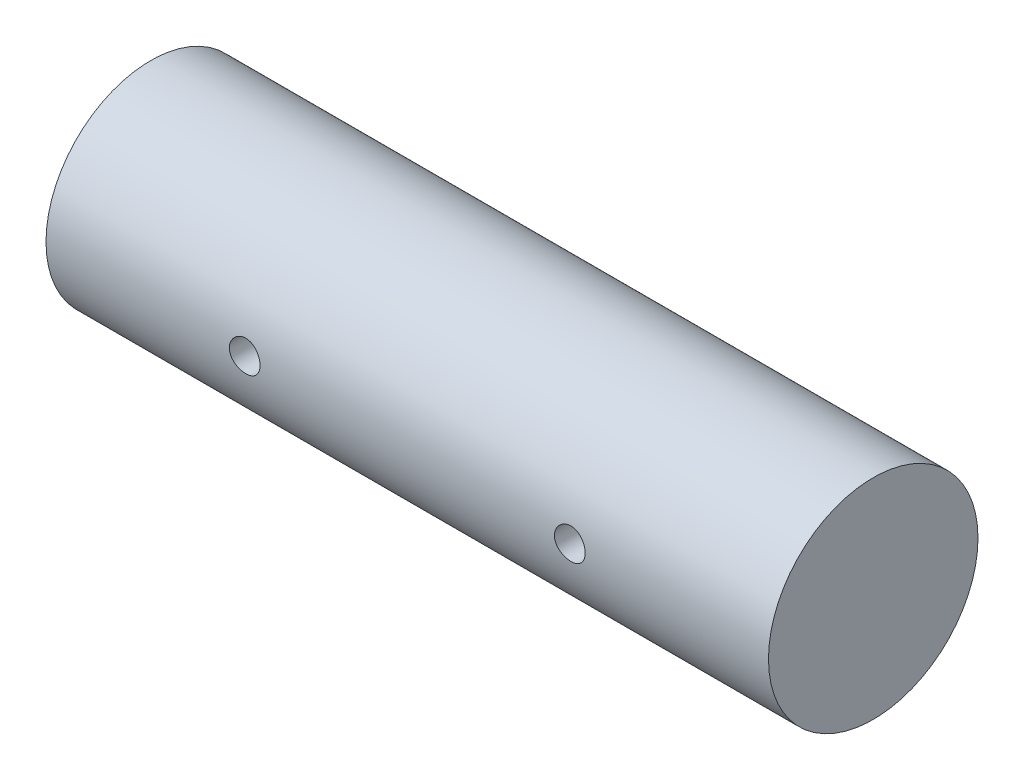
ISO-10303-21;
HEADER;
FILE_DESCRIPTION(('STEP AP214'),'2;1');
FILE_NAME('part.step','',(''),(''),'','','');
FILE_SCHEMA(('AUTOMOTIVE_DESIGN { 1 0 10303 214 1 1 1 1 }'));
ENDSEC;
DATA;
#1=APPLICATION_CONTEXT('core data for automotive mechanical design processes');
#2=APPLICATION_PROTOCOL_DEFINITION('international standard','automotive_design',2000,#1);
#3=PRODUCT_CONTEXT('',#1,'mechanical');
#4=PRODUCT('Part','Part','',(#3));
#5=PRODUCT_RELATED_PRODUCT_CATEGORY('part','',(#4));
#6=PRODUCT_DEFINITION_FORMATION('','',#4);
#7=PRODUCT_DEFINITION_CONTEXT('part definition',#1,'design');
#8=PRODUCT_DEFINITION('design','',#6,#7);
#9=PRODUCT_DEFINITION_SHAPE('','',#8);
#10=(LENGTH_UNIT() NAMED_UNIT(*) SI_UNIT(.MILLI.,.METRE.));
#11=(NAMED_UNIT(*) PLANE_ANGLE_UNIT() SI_UNIT($,.RADIAN.));
#12=(NAMED_UNIT(*) SI_UNIT($,.STERADIAN.) SOLID_ANGLE_UNIT());
#13=UNCERTAINTY_MEASURE_WITH_UNIT(LENGTH_MEASURE(1.E-05),#10,'distance_accuracy_value','');
#14=(GEOMETRIC_REPRESENTATION_CONTEXT(3) GLOBAL_UNCERTAINTY_ASSIGNED_CONTEXT((#13)) GLOBAL_UNIT_ASSIGNED_CONTEXT((#10,
#11,#12)) REPRESENTATION_CONTEXT('',''));
#15=CARTESIAN_POINT('',(0.,0.,0.));
#16=DIRECTION('',(0.,0.,1.));
#17=DIRECTION('',(1.,0.,0.));
#18=AXIS2_PLACEMENT_3D('',#15,#16,#17);
#19=CARTESIAN_POINT('',(40.,0.,0.));
#20=DIRECTION('',(-1.,0.,0.));
#21=DIRECTION('',(0.,0.,1.));
#22=AXIS2_PLACEMENT_3D('',#19,#20,#21);
#23=CYLINDRICAL_SURFACE('',#22,11.6);
#24=CARTESIAN_POINT('',(19.7,0.,-11.6));
#25=CARTESIAN_POINT('',(19.6999960653962,0.0949441704082005,-11.5999985029467));
#26=CARTESIAN_POINT('',(19.6920192743421,0.189944063715869,-11.5988221151934));
#27=CARTESIAN_POINT('',(19.6603299452185,0.377290223226358,-11.5942424798553));
#28=CARTESIAN_POINT('',(19.6366019206049,0.469633784416005,-11.5908370407231));
#29=CARTESIAN_POINT('',(19.5741328649994,0.648928750986322,-11.5821821379595));
#30=CARTESIAN_POINT('',(19.5354029981327,0.735884110490315,-11.5769340458714));
#31=CARTESIAN_POINT('',(19.4440565342049,0.902047785144064,-11.5651743088709));
#32=CARTESIAN_POINT('',(19.391441932554,0.981257211241409,-11.5586628455563));
#33=CARTESIAN_POINT('',(19.2734005285515,1.13028607513739,-11.5450464955596));
#34=CARTESIAN_POINT('',(19.2078905005261,1.20003926368543,-11.5379379358699));
#35=CARTESIAN_POINT('',(19.0660968912683,1.32760417280411,-11.5239574473542));
#36=CARTESIAN_POINT('',(18.9898127018215,1.38541521877251,-11.5170855319144));
#37=CARTESIAN_POINT('',(18.8281931140253,1.48771113506777,-11.5043207045965));
#38=CARTESIAN_POINT('',(18.7428169191534,1.53213219357051,-11.4984325384436));
#39=CARTESIAN_POINT('',(18.5657148573772,1.60597943445323,-11.4883518260919));
#40=CARTESIAN_POINT('',(18.4739893209788,1.63540639666374,-11.4841591917123));
#41=CARTESIAN_POINT('',(18.2874878572182,1.67822499198253,-11.4779802333275));
#42=CARTESIAN_POINT('',(18.19273844729,1.69172983738303,-11.4759783397343));
#43=CARTESIAN_POINT('',(18.0022987410202,1.70267150825672,-11.4743602095548));
#44=CARTESIAN_POINT('',(17.9066084965689,1.70010921498076,-11.4747438421272));
#45=CARTESIAN_POINT('',(17.7178015533313,1.67908192227481,-11.4778391786219));
#46=CARTESIAN_POINT('',(17.6246704894264,1.6607428063319,-11.4805324533403));
#47=CARTESIAN_POINT('',(17.4428218367209,1.60887941010949,-11.4879148293138));
#48=CARTESIAN_POINT('',(17.3541043676409,1.57535471816369,-11.4926039846752));
#49=CARTESIAN_POINT('',(17.1832170648401,1.49394023959204,-11.5034702111887));
#50=CARTESIAN_POINT('',(17.101073097556,1.44599692771396,-11.5096528092168));
#51=CARTESIAN_POINT('',(16.9459484142681,1.33714428768831,-11.5228052658655));
#52=CARTESIAN_POINT('',(16.8729682731728,1.27623414668975,-11.5297751738274));
#53=CARTESIAN_POINT('',(16.737513141539,1.14248488086287,-11.5437984217603));
#54=CARTESIAN_POINT('',(16.6751450266691,1.06953748394285,-11.5508519232699));
#55=CARTESIAN_POINT('',(16.5635204898828,0.914153991695908,-11.5641857823648));
#56=CARTESIAN_POINT('',(16.5142641207638,0.831717858162324,-11.5704661368369));
#57=CARTESIAN_POINT('',(16.4302565950257,0.659605830935828,-11.5815522124716));
#58=CARTESIAN_POINT('',(16.3955134534869,0.56992596935546,-11.5863571184156));
#59=CARTESIAN_POINT('',(16.3416103245342,0.38591855786747,-11.5939440280769));
#60=CARTESIAN_POINT('',(16.3224493319431,0.291591308171175,-11.5967261622784));
#61=CARTESIAN_POINT('',(16.3003959923544,0.101889385741688,-11.5999368244918));
#62=CARTESIAN_POINT('',(16.2973566699506,0.00653214574636756,-11.6003866147861));
#63=CARTESIAN_POINT('',(16.3072431610648,-0.183330597340464,-11.5989397182681));
#64=CARTESIAN_POINT('',(16.3201685034399,-0.277836125484446,-11.597043100702));
#65=CARTESIAN_POINT('',(16.3614952176391,-0.462869296261393,-11.5911296519111));
#66=CARTESIAN_POINT('',(16.3898252099126,-0.553413220747537,-11.5871226023306));
#67=CARTESIAN_POINT('',(16.4610819244018,-0.728465916840584,-11.5774362296228));
#68=CARTESIAN_POINT('',(16.504009304959,-0.812974416042041,-11.5717568310743));
#69=CARTESIAN_POINT('',(16.6035886550346,-0.974205169967985,-11.5593043111252));
#70=CARTESIAN_POINT('',(16.6603341308172,-1.05086909596348,-11.5525238476943));
#71=CARTESIAN_POINT('',(16.7858083821739,-1.19363796264713,-11.5386473670558));
#72=CARTESIAN_POINT('',(16.854537820909,-1.25974231860835,-11.5315513324014));
#73=CARTESIAN_POINT('',(17.0026823376961,-1.38004841240152,-11.5177763212394));
#74=CARTESIAN_POINT('',(17.0821776980993,-1.43415178461187,-11.511101090913));
#75=CARTESIAN_POINT('',(17.2492143099238,-1.52823700978224,-11.4989891444617));
#76=CARTESIAN_POINT('',(17.3367553517391,-1.56821923049485,-11.4935523960846));
#77=CARTESIAN_POINT('',(17.517101480706,-1.63277373278797,-11.484559885182));
#78=CARTESIAN_POINT('',(17.6098875115177,-1.65739832458302,-11.4809977440333));
#79=CARTESIAN_POINT('',(17.798334125113,-1.69070537285839,-11.4761406153472));
#80=CARTESIAN_POINT('',(17.8939945187543,-1.69938887598882,-11.4748454789645));
#81=CARTESIAN_POINT('',(18.0844942736185,-1.70054319614699,-11.474674383629));
#82=CARTESIAN_POINT('',(18.1793327134321,-1.69316865315152,-11.4757753500054));
#83=CARTESIAN_POINT('',(18.3664053057344,-1.66274702136101,-11.4802223412806));
#84=CARTESIAN_POINT('',(18.4586394616537,-1.63969995321317,-11.4835683632219));
#85=CARTESIAN_POINT('',(18.6378457517677,-1.5786412623566,-11.4921205237448));
#86=CARTESIAN_POINT('',(18.7248214660577,-1.5406399563423,-11.4973253797176));
#87=CARTESIAN_POINT('',(18.8911876309358,-1.45076683620476,-11.5090103870547));
#88=CARTESIAN_POINT('',(18.9705778482006,-1.39889459560994,-11.5154905776284));
#89=CARTESIAN_POINT('',(19.1203058776989,-1.28218839437555,-11.5290704750903));
#90=CARTESIAN_POINT('',(19.1905538610109,-1.21723977376571,-11.5361753248199));
#91=CARTESIAN_POINT('',(19.3192092469075,-1.07646664645854,-11.550160695714));
#92=CARTESIAN_POINT('',(19.3776138885792,-1.00063961080983,-11.5570411642579));
#93=CARTESIAN_POINT('',(19.4811966780988,-0.839795778228316,-11.5698435740675));
#94=CARTESIAN_POINT('',(19.5263038890953,-0.754732892976381,-11.575760301765));
#95=CARTESIAN_POINT('',(19.6015242341408,-0.57819293451448,-11.5859172887544));
#96=CARTESIAN_POINT('',(19.6316530116771,-0.48672266761139,-11.5901592961679));
#97=CARTESIAN_POINT('',(19.6691697546632,-0.329026934046586,-11.5955124526173));
#98=CARTESIAN_POINT('',(19.6807135868415,-0.263778246237803,-11.5971867069034));
#99=CARTESIAN_POINT('',(19.696130036636,-0.132362060449713,-11.5994309960629));
#100=CARTESIAN_POINT('',(19.7000027431849,-0.0661945731311702,-11.6000010437376));
#101=CARTESIAN_POINT('',(19.7,0.,-11.6));
#102=B_SPLINE_CURVE_WITH_KNOTS('',3,(#24,#25,#26,#27,#28,#29,#30,#31,#32,#33,#34,#35,#36,#37,
#38,#39,#40,#41,#42,#43,#44,#45,#46,#47,#48,#49,#50,#51,#52,#53,#54,#55,#56,#57,#58,#59,#60,#61,
#62,#63,#64,#65,#66,#67,#68,#69,#70,#71,#72,#73,#74,#75,#76,#77,#78,#79,#80,#81,#82,#83,#84,#85,
#86,#87,#88,#89,#90,#91,#92,#93,#94,#95,#96,#97,#98,#99,#100,#101),.UNSPECIFIED.,.T.,.F.,(4,2,2,
2,2,2,2,2,2,2,2,2,2,2,2,2,2,2,2,2,2,2,2,2,2,2,2,2,2,2,2,2,2,2,2,2,2,2,4),(0.,0.28459064348003,
0.569461510486023,0.854120787299275,1.13873917726716,1.42525853515622,1.71179407387481,
1.99967429984758,2.2875395518793,2.57334538619036,2.85913554475245,3.14266630840605,
3.42620475876485,3.71080904156847,3.99543117060305,4.28276894145672,4.5701078693243,
4.8576052739703,5.1450841311871,5.42993758636653,5.71478263526655,5.99831892547657,
6.28186800485681,6.56739193794673,6.85293167619751,7.1407317954293,7.42852441902267,
7.71533134927826,8.002119447869,8.28615798276282,8.57019614346127,8.85403869324754,
9.13788997097504,9.4243480145536,9.71087276048895,9.99889944212864,10.2866246731954,
10.4850420639794,10.6834571544614),.UNSPECIFIED.);
#103=CARTESIAN_POINT('',(19.7,0.,-11.6));
#104=VERTEX_POINT('',#103);
#105=EDGE_CURVE('E10',#104,#104,#102,.T.);
#106=ORIENTED_EDGE('',*,*,#105,.T.);
#107=EDGE_LOOP('',(#106));
#108=FACE_BOUND('',#107,.T.);
#109=CARTESIAN_POINT('',(19.7,0.,11.6));
#110=CARTESIAN_POINT('',(19.6999960653962,-0.0949441704082005,11.5999985029467));
#111=CARTESIAN_POINT('',(19.6920192743421,-0.189944063715869,11.5988221151934));
#112=CARTESIAN_POINT('',(19.6603299452185,-0.377290223226358,11.5942424798553));
#113=CARTESIAN_POINT('',(19.6366019206049,-0.469633784416005,11.5908370407231));
#114=CARTESIAN_POINT('',(19.5741328649994,-0.648928750986322,11.5821821379595));
#115=CARTESIAN_POINT('',(19.5354029981327,-0.735884110490315,11.5769340458714));
#116=CARTESIAN_POINT('',(19.4440565342049,-0.902047785144064,11.5651743088709));
#117=CARTESIAN_POINT('',(19.391441932554,-0.981257211241409,11.5586628455563));
#118=CARTESIAN_POINT('',(19.2734005285515,-1.13028607513739,11.5450464955596));
#119=CARTESIAN_POINT('',(19.2078905005261,-1.20003926368543,11.5379379358699));
#120=CARTESIAN_POINT('',(19.0660968912683,-1.32760417280411,11.5239574473542));
#121=CARTESIAN_POINT('',(18.9898127018215,-1.38541521877251,11.5170855319144));
#122=CARTESIAN_POINT('',(18.8281931140253,-1.48771113506777,11.5043207045965));
#123=CARTESIAN_POINT('',(18.7428169191534,-1.53213219357051,11.4984325384436));
#124=CARTESIAN_POINT('',(18.5657148573772,-1.60597943445323,11.4883518260919));
#125=CARTESIAN_POINT('',(18.4739893209788,-1.63540639666374,11.4841591917123));
#126=CARTESIAN_POINT('',(18.2874878572182,-1.67822499198253,11.4779802333275));
#127=CARTESIAN_POINT('',(18.19273844729,-1.69172983738303,11.4759783397343));
#128=CARTESIAN_POINT('',(18.0022987410202,-1.70267150825672,11.4743602095548));
#129=CARTESIAN_POINT('',(17.9066084965689,-1.70010921498076,11.4747438421272));
#130=CARTESIAN_POINT('',(17.7178015533313,-1.67908192227481,11.4778391786219));
#131=CARTESIAN_POINT('',(17.6246704894264,-1.6607428063319,11.4805324533403));
#132=CARTESIAN_POINT('',(17.4428218367209,-1.60887941010949,11.4879148293138));
#133=CARTESIAN_POINT('',(17.3541043676409,-1.57535471816369,11.4926039846752));
#134=CARTESIAN_POINT('',(17.1832170648401,-1.49394023959204,11.5034702111887));
#135=CARTESIAN_POINT('',(17.101073097556,-1.44599692771396,11.5096528092168));
#136=CARTESIAN_POINT('',(16.9459484142681,-1.33714428768831,11.5228052658655));
#137=CARTESIAN_POINT('',(16.8729682731728,-1.27623414668975,11.5297751738274));
#138=CARTESIAN_POINT('',(16.737513141539,-1.14248488086287,11.5437984217603));
#139=CARTESIAN_POINT('',(16.6751450266691,-1.06953748394285,11.5508519232699));
#140=CARTESIAN_POINT('',(16.5635204898828,-0.914153991695908,11.5641857823648));
#141=CARTESIAN_POINT('',(16.5142641207638,-0.831717858162324,11.5704661368369));
#142=CARTESIAN_POINT('',(16.4302565950257,-0.659605830935828,11.5815522124716));
#143=CARTESIAN_POINT('',(16.3955134534869,-0.56992596935546,11.5863571184156));
#144=CARTESIAN_POINT('',(16.3416103245342,-0.38591855786747,11.5939440280769));
#145=CARTESIAN_POINT('',(16.3224493319431,-0.291591308171175,11.5967261622784));
#146=CARTESIAN_POINT('',(16.3003959923544,-0.101889385741688,11.5999368244918));
#147=CARTESIAN_POINT('',(16.2973566699506,-0.00653214574636756,11.6003866147861));
#148=CARTESIAN_POINT('',(16.3072431610648,0.183330597340464,11.5989397182681));
#149=CARTESIAN_POINT('',(16.3201685034399,0.277836125484446,11.597043100702));
#150=CARTESIAN_POINT('',(16.3614952176391,0.462869296261393,11.5911296519111));
#151=CARTESIAN_POINT('',(16.3898252099126,0.553413220747537,11.5871226023306));
#152=CARTESIAN_POINT('',(16.4610819244018,0.728465916840584,11.5774362296228));
#153=CARTESIAN_POINT('',(16.504009304959,0.812974416042041,11.5717568310743));
#154=CARTESIAN_POINT('',(16.6035886550346,0.974205169967985,11.5593043111252));
#155=CARTESIAN_POINT('',(16.6603341308172,1.05086909596348,11.5525238476943));
#156=CARTESIAN_POINT('',(16.7858083821739,1.19363796264713,11.5386473670558));
#157=CARTESIAN_POINT('',(16.854537820909,1.25974231860835,11.5315513324014));
#158=CARTESIAN_POINT('',(17.0026823376961,1.38004841240152,11.5177763212394));
#159=CARTESIAN_POINT('',(17.0821776980993,1.43415178461187,11.511101090913));
#160=CARTESIAN_POINT('',(17.2492143099238,1.52823700978224,11.4989891444617));
#161=CARTESIAN_POINT('',(17.3367553517391,1.56821923049485,11.4935523960846));
#162=CARTESIAN_POINT('',(17.517101480706,1.63277373278797,11.484559885182));
#163=CARTESIAN_POINT('',(17.6098875115177,1.65739832458302,11.4809977440333));
#164=CARTESIAN_POINT('',(17.798334125113,1.69070537285839,11.4761406153472));
#165=CARTESIAN_POINT('',(17.8939945187543,1.69938887598882,11.4748454789645));
#166=CARTESIAN_POINT('',(18.0844942736185,1.70054319614699,11.474674383629));
#167=CARTESIAN_POINT('',(18.1793327134321,1.69316865315152,11.4757753500054));
#168=CARTESIAN_POINT('',(18.3664053057344,1.66274702136101,11.4802223412806));
#169=CARTESIAN_POINT('',(18.4586394616537,1.63969995321317,11.4835683632219));
#170=CARTESIAN_POINT('',(18.6378457517677,1.5786412623566,11.4921205237448));
#171=CARTESIAN_POINT('',(18.7248214660577,1.5406399563423,11.4973253797176));
#172=CARTESIAN_POINT('',(18.8911876309358,1.45076683620476,11.5090103870547));
#173=CARTESIAN_POINT('',(18.9705778482006,1.39889459560994,11.5154905776284));
#174=CARTESIAN_POINT('',(19.1203058776989,1.28218839437555,11.5290704750903));
#175=CARTESIAN_POINT('',(19.1905538610109,1.21723977376571,11.5361753248199));
#176=CARTESIAN_POINT('',(19.3192092469075,1.07646664645854,11.550160695714));
#177=CARTESIAN_POINT('',(19.3776138885792,1.00063961080983,11.5570411642579));
#178=CARTESIAN_POINT('',(19.4811966780988,0.839795778228316,11.5698435740675));
#179=CARTESIAN_POINT('',(19.5263038890953,0.754732892976381,11.575760301765));
#180=CARTESIAN_POINT('',(19.6015242341408,0.57819293451448,11.5859172887544));
#181=CARTESIAN_POINT('',(19.6316530116771,0.48672266761139,11.5901592961679));
#182=CARTESIAN_POINT('',(19.6691697546632,0.329026934046586,11.5955124526173));
#183=CARTESIAN_POINT('',(19.6807135868415,0.263778246237803,11.5971867069034));
#184=CARTESIAN_POINT('',(19.696130036636,0.132362060449713,11.5994309960629));
#185=CARTESIAN_POINT('',(19.7000027431849,0.0661945731311702,11.6000010437376));
#186=CARTESIAN_POINT('',(19.7,0.,11.6));
#187=B_SPLINE_CURVE_WITH_KNOTS('',3,(#109,#110,#111,#112,#113,#114,#115,#116,#117,#118,#119,
#120,#121,#122,#123,#124,#125,#126,#127,#128,#129,#130,#131,#132,#133,#134,#135,#136,#137,#138,
#139,#140,#141,#142,#143,#144,#145,#146,#147,#148,#149,#150,#151,#152,#153,#154,#155,#156,#157,
#158,#159,#160,#161,#162,#163,#164,#165,#166,#167,#168,#169,#170,#171,#172,#173,#174,#175,#176,
#177,#178,#179,#180,#181,#182,#183,#184,#185,#186),.UNSPECIFIED.,.T.,.F.,(4,2,2,2,2,2,2,2,2,2,2,
2,2,2,2,2,2,2,2,2,2,2,2,2,2,2,2,2,2,2,2,2,2,2,2,2,2,2,4),(0.,0.28459064348003,0.569461510486023,
0.854120787299275,1.13873917726716,1.42525853515622,1.71179407387481,1.99967429984758,
2.2875395518793,2.57334538619036,2.85913554475245,3.14266630840605,3.42620475876485,
3.71080904156847,3.99543117060305,4.28276894145672,4.5701078693243,4.8576052739703,
5.1450841311871,5.42993758636653,5.71478263526655,5.99831892547657,6.28186800485681,
6.56739193794673,6.85293167619751,7.1407317954293,7.42852441902267,7.71533134927826,
8.002119447869,8.28615798276282,8.57019614346127,8.85403869324754,9.13788997097504,
9.4243480145536,9.71087276048895,9.99889944212864,10.2866246731954,10.4850420639794,
10.6834571544614),.UNSPECIFIED.);
#188=CARTESIAN_POINT('',(19.7,0.,11.6));
#189=VERTEX_POINT('',#188);
#190=EDGE_CURVE('E48',#189,#189,#187,.T.);
#191=ORIENTED_EDGE('',*,*,#190,.T.);
#192=EDGE_LOOP('',(#191));
#193=FACE_BOUND('',#192,.T.);
#194=CARTESIAN_POINT('',(-16.3,0.,-11.6));
#195=CARTESIAN_POINT('',(-16.3000039346038,0.0949441704082005,-11.5999985029467));
#196=CARTESIAN_POINT('',(-16.3079807256579,0.189944063715869,-11.5988221151934));
#197=CARTESIAN_POINT('',(-16.3396700547815,0.377290223226358,-11.5942424798553));
#198=CARTESIAN_POINT('',(-16.3633980793951,0.469633784416005,-11.5908370407231));
#199=CARTESIAN_POINT('',(-16.4258671350005,0.648928750986322,-11.5821821379595));
#200=CARTESIAN_POINT('',(-16.4645970018673,0.735884110490315,-11.5769340458714));
#201=CARTESIAN_POINT('',(-16.5559434657951,0.902047785144064,-11.5651743088709));
#202=CARTESIAN_POINT('',(-16.6085580674459,0.981257211241409,-11.5586628455563));
#203=CARTESIAN_POINT('',(-16.7265994714485,1.13028607513739,-11.5450464955596));
#204=CARTESIAN_POINT('',(-16.7921094994739,1.20003926368543,-11.5379379358699));
#205=CARTESIAN_POINT('',(-16.9339031087317,1.32760417280411,-11.5239574473542));
#206=CARTESIAN_POINT('',(-17.0101872981785,1.38541521877251,-11.5170855319144));
#207=CARTESIAN_POINT('',(-17.1718068859747,1.48771113506777,-11.5043207045965));
#208=CARTESIAN_POINT('',(-17.2571830808466,1.53213219357052,-11.4984325384436));
#209=CARTESIAN_POINT('',(-17.4342851426228,1.60597943445323,-11.4883518260919));
#210=CARTESIAN_POINT('',(-17.5260106790212,1.63540639666374,-11.4841591917123));
#211=CARTESIAN_POINT('',(-17.7125121427818,1.67822499198253,-11.4779802333275));
#212=CARTESIAN_POINT('',(-17.80726155271,1.69172983738303,-11.4759783397343));
#213=CARTESIAN_POINT('',(-17.9977012589798,1.70267150825672,-11.4743602095548));
#214=CARTESIAN_POINT('',(-18.0933915034311,1.70010921498076,-11.4747438421272));
#215=CARTESIAN_POINT('',(-18.2821984466687,1.67908192227481,-11.4778391786219));
#216=CARTESIAN_POINT('',(-18.3753295105736,1.6607428063319,-11.4805324533403));
#217=CARTESIAN_POINT('',(-18.5571781632791,1.60887941010949,-11.4879148293138));
#218=CARTESIAN_POINT('',(-18.6458956323591,1.57535471816369,-11.4926039846752));
#219=CARTESIAN_POINT('',(-18.8167829351599,1.49394023959204,-11.5034702111887));
#220=CARTESIAN_POINT('',(-18.898926902444,1.44599692771396,-11.5096528092168));
#221=CARTESIAN_POINT('',(-19.0540515857319,1.33714428768831,-11.5228052658655));
#222=CARTESIAN_POINT('',(-19.1270317268271,1.27623414668975,-11.5297751738274));
#223=CARTESIAN_POINT('',(-19.262486858461,1.14248488086287,-11.5437984217603));
#224=CARTESIAN_POINT('',(-19.3248549733309,1.06953748394285,-11.5508519232699));
#225=CARTESIAN_POINT('',(-19.4364795101172,0.914153991695908,-11.5641857823648));
#226=CARTESIAN_POINT('',(-19.4857358792362,0.831717858162324,-11.5704661368369));
#227=CARTESIAN_POINT('',(-19.5697434049743,0.659605830935828,-11.5815522124716));
#228=CARTESIAN_POINT('',(-19.6044865465131,0.56992596935546,-11.5863571184156));
#229=CARTESIAN_POINT('',(-19.6583896754658,0.385918557867471,-11.5939440280769));
#230=CARTESIAN_POINT('',(-19.6775506680569,0.291591308171175,-11.5967261622784));
#231=CARTESIAN_POINT('',(-19.6996040076456,0.101889385741688,-11.5999368244918));
#232=CARTESIAN_POINT('',(-19.7026433300494,0.00653214574636746,-11.6003866147861));
#233=CARTESIAN_POINT('',(-19.6927568389352,-0.183330597340464,-11.5989397182681));
#234=CARTESIAN_POINT('',(-19.6798314965601,-0.277836125484446,-11.597043100702));
#235=CARTESIAN_POINT('',(-19.6385047823609,-0.462869296261393,-11.5911296519111));
#236=CARTESIAN_POINT('',(-19.6101747900874,-0.553413220747537,-11.5871226023306));
#237=CARTESIAN_POINT('',(-19.5389180755982,-0.728465916840584,-11.5774362296228));
#238=CARTESIAN_POINT('',(-19.495990695041,-0.812974416042041,-11.5717568310743));
#239=CARTESIAN_POINT('',(-19.3964113449654,-0.974205169967986,-11.5593043111252));
#240=CARTESIAN_POINT('',(-19.3396658691828,-1.05086909596348,-11.5525238476943));
#241=CARTESIAN_POINT('',(-19.2141916178261,-1.19363796264713,-11.5386473670558));
#242=CARTESIAN_POINT('',(-19.145462179091,-1.25974231860835,-11.5315513324014));
#243=CARTESIAN_POINT('',(-18.9973176623039,-1.38004841240152,-11.5177763212394));
#244=CARTESIAN_POINT('',(-18.9178223019007,-1.43415178461187,-11.511101090913));
#245=CARTESIAN_POINT('',(-18.7507856900762,-1.52823700978224,-11.4989891444617));
#246=CARTESIAN_POINT('',(-18.6632446482609,-1.56821923049485,-11.4935523960846));
#247=CARTESIAN_POINT('',(-18.482898519294,-1.63277373278797,-11.484559885182));
#248=CARTESIAN_POINT('',(-18.3901124884823,-1.65739832458302,-11.4809977440333));
#249=CARTESIAN_POINT('',(-18.201665874887,-1.69070537285839,-11.4761406153472));
#250=CARTESIAN_POINT('',(-18.1060054812457,-1.69938887598882,-11.4748454789645));
#251=CARTESIAN_POINT('',(-17.9155057263815,-1.70054319614699,-11.474674383629));
#252=CARTESIAN_POINT('',(-17.8206672865679,-1.69316865315152,-11.4757753500054));
#253=CARTESIAN_POINT('',(-17.6335946942656,-1.66274702136101,-11.4802223412806));
#254=CARTESIAN_POINT('',(-17.5413605383463,-1.63969995321317,-11.4835683632219));
#255=CARTESIAN_POINT('',(-17.3621542482323,-1.5786412623566,-11.4921205237448));
#256=CARTESIAN_POINT('',(-17.2751785339423,-1.5406399563423,-11.4973253797176));
#257=CARTESIAN_POINT('',(-17.1088123690642,-1.45076683620476,-11.5090103870547));
#258=CARTESIAN_POINT('',(-17.0294221517994,-1.39889459560994,-11.5154905776284));
#259=CARTESIAN_POINT('',(-16.8796941223011,-1.28218839437555,-11.5290704750903));
#260=CARTESIAN_POINT('',(-16.8094461389891,-1.21723977376571,-11.5361753248199));
#261=CARTESIAN_POINT('',(-16.6807907530925,-1.07646664645854,-11.550160695714));
#262=CARTESIAN_POINT('',(-16.6223861114208,-1.00063961080983,-11.5570411642579));
#263=CARTESIAN_POINT('',(-16.5188033219011,-0.839795778228316,-11.5698435740675));
#264=CARTESIAN_POINT('',(-16.4736961109047,-0.754732892976382,-11.575760301765));
#265=CARTESIAN_POINT('',(-16.3984757658592,-0.578192934514481,-11.5859172887544));
#266=CARTESIAN_POINT('',(-16.3683469883229,-0.48672266761139,-11.5901592961679));
#267=CARTESIAN_POINT('',(-16.3308302453368,-0.329026934046586,-11.5955124526173));
#268=CARTESIAN_POINT('',(-16.3192864131585,-0.263778246237803,-11.5971867069034));
#269=CARTESIAN_POINT('',(-16.303869963364,-0.132362060449713,-11.5994309960629));
#270=CARTESIAN_POINT('',(-16.299997256815,-0.0661945731311702,-11.6000010437376));
#271=CARTESIAN_POINT('',(-16.3,0.,-11.6));
#272=B_SPLINE_CURVE_WITH_KNOTS('',3,(#194,#195,#196,#197,#198,#199,#200,#201,#202,#203,#204,
#205,#206,#207,#208,#209,#210,#211,#212,#213,#214,#215,#216,#217,#218,#219,#220,#221,#222,#223,
#224,#225,#226,#227,#228,#229,#230,#231,#232,#233,#234,#235,#236,#237,#238,#239,#240,#241,#242,
#243,#244,#245,#246,#247,#248,#249,#250,#251,#252,#253,#254,#255,#256,#257,#258,#259,#260,#261,
#262,#263,#264,#265,#266,#267,#268,#269,#270,#271),.UNSPECIFIED.,.T.,.F.,(4,2,2,2,2,2,2,2,2,2,2,
2,2,2,2,2,2,2,2,2,2,2,2,2,2,2,2,2,2,2,2,2,2,2,2,2,2,2,4),(0.,0.28459064348003,0.569461510486023,
0.854120787299275,1.13873917726716,1.42525853515622,1.71179407387481,1.99967429984759,
2.2875395518793,2.57334538619036,2.85913554475245,3.14266630840605,3.42620475876485,
3.71080904156846,3.99543117060305,4.28276894145672,4.5701078693243,4.8576052739703,
5.1450841311871,5.42993758636653,5.71478263526655,5.99831892547657,6.28186800485681,
6.56739193794673,6.85293167619751,7.1407317954293,7.42852441902266,7.71533134927825,
8.002119447869,8.28615798276281,8.57019614346127,8.85403869324754,9.13788997097504,
9.42434801455359,9.71087276048895,9.99889944212864,10.2866246731954,10.4850420639794,
10.6834571544614),.UNSPECIFIED.);
#273=CARTESIAN_POINT('',(-16.3,0.,-11.6));
#274=VERTEX_POINT('',#273);
#275=EDGE_CURVE('E52',#274,#274,#272,.T.);
#276=ORIENTED_EDGE('',*,*,#275,.T.);
#277=EDGE_LOOP('',(#276));
#278=FACE_BOUND('',#277,.T.);
#279=CARTESIAN_POINT('',(-16.3,0.,11.6));
#280=CARTESIAN_POINT('',(-16.3000039346038,-0.0949441704082005,11.5999985029467));
#281=CARTESIAN_POINT('',(-16.3079807256579,-0.189944063715869,11.5988221151934));
#282=CARTESIAN_POINT('',(-16.3396700547815,-0.377290223226358,11.5942424798553));
#283=CARTESIAN_POINT('',(-16.3633980793951,-0.469633784416005,11.5908370407231));
#284=CARTESIAN_POINT('',(-16.4258671350005,-0.648928750986322,11.5821821379595));
#285=CARTESIAN_POINT('',(-16.4645970018673,-0.735884110490315,11.5769340458714));
#286=CARTESIAN_POINT('',(-16.5559434657951,-0.902047785144064,11.5651743088709));
#287=CARTESIAN_POINT('',(-16.6085580674459,-0.981257211241409,11.5586628455563));
#288=CARTESIAN_POINT('',(-16.7265994714485,-1.13028607513739,11.5450464955596));
#289=CARTESIAN_POINT('',(-16.7921094994739,-1.20003926368543,11.5379379358699));
#290=CARTESIAN_POINT('',(-16.9339031087317,-1.32760417280411,11.5239574473542));
#291=CARTESIAN_POINT('',(-17.0101872981785,-1.38541521877251,11.5170855319144));
#292=CARTESIAN_POINT('',(-17.1718068859747,-1.48771113506777,11.5043207045965));
#293=CARTESIAN_POINT('',(-17.2571830808466,-1.53213219357052,11.4984325384436));
#294=CARTESIAN_POINT('',(-17.4342851426228,-1.60597943445323,11.4883518260919));
#295=CARTESIAN_POINT('',(-17.5260106790212,-1.63540639666374,11.4841591917123));
#296=CARTESIAN_POINT('',(-17.7125121427818,-1.67822499198253,11.4779802333275));
#297=CARTESIAN_POINT('',(-17.80726155271,-1.69172983738303,11.4759783397343));
#298=CARTESIAN_POINT('',(-17.9977012589798,-1.70267150825672,11.4743602095548));
#299=CARTESIAN_POINT('',(-18.0933915034311,-1.70010921498076,11.4747438421272));
#300=CARTESIAN_POINT('',(-18.2821984466687,-1.67908192227481,11.4778391786219));
#301=CARTESIAN_POINT('',(-18.3753295105736,-1.6607428063319,11.4805324533403));
#302=CARTESIAN_POINT('',(-18.5571781632791,-1.60887941010949,11.4879148293138));
#303=CARTESIAN_POINT('',(-18.6458956323591,-1.57535471816369,11.4926039846752));
#304=CARTESIAN_POINT('',(-18.8167829351599,-1.49394023959204,11.5034702111887));
#305=CARTESIAN_POINT('',(-18.898926902444,-1.44599692771396,11.5096528092168));
#306=CARTESIAN_POINT('',(-19.0540515857319,-1.33714428768831,11.5228052658655));
#307=CARTESIAN_POINT('',(-19.1270317268271,-1.27623414668975,11.5297751738274));
#308=CARTESIAN_POINT('',(-19.262486858461,-1.14248488086287,11.5437984217603));
#309=CARTESIAN_POINT('',(-19.3248549733309,-1.06953748394285,11.5508519232699));
#310=CARTESIAN_POINT('',(-19.4364795101172,-0.914153991695908,11.5641857823648));
#311=CARTESIAN_POINT('',(-19.4857358792362,-0.831717858162324,11.5704661368369));
#312=CARTESIAN_POINT('',(-19.5697434049743,-0.659605830935828,11.5815522124716));
#313=CARTESIAN_POINT('',(-19.6044865465131,-0.56992596935546,11.5863571184156));
#314=CARTESIAN_POINT('',(-19.6583896754658,-0.385918557867471,11.5939440280769));
#315=CARTESIAN_POINT('',(-19.6775506680569,-0.291591308171175,11.5967261622784));
#316=CARTESIAN_POINT('',(-19.6996040076456,-0.101889385741688,11.5999368244918));
#317=CARTESIAN_POINT('',(-19.7026433300494,-0.00653214574636746,11.6003866147861));
#318=CARTESIAN_POINT('',(-19.6927568389352,0.183330597340464,11.5989397182681));
#319=CARTESIAN_POINT('',(-19.6798314965601,0.277836125484446,11.597043100702));
#320=CARTESIAN_POINT('',(-19.6385047823609,0.462869296261393,11.5911296519111));
#321=CARTESIAN_POINT('',(-19.6101747900874,0.553413220747537,11.5871226023306));
#322=CARTESIAN_POINT('',(-19.5389180755982,0.728465916840584,11.5774362296228));
#323=CARTESIAN_POINT('',(-19.495990695041,0.812974416042041,11.5717568310743));
#324=CARTESIAN_POINT('',(-19.3964113449654,0.974205169967986,11.5593043111252));
#325=CARTESIAN_POINT('',(-19.3396658691828,1.05086909596348,11.5525238476943));
#326=CARTESIAN_POINT('',(-19.2141916178261,1.19363796264713,11.5386473670558));
#327=CARTESIAN_POINT('',(-19.145462179091,1.25974231860835,11.5315513324014));
#328=CARTESIAN_POINT('',(-18.9973176623039,1.38004841240152,11.5177763212394));
#329=CARTESIAN_POINT('',(-18.9178223019007,1.43415178461187,11.511101090913));
#330=CARTESIAN_POINT('',(-18.7507856900762,1.52823700978224,11.4989891444617));
#331=CARTESIAN_POINT('',(-18.6632446482609,1.56821923049485,11.4935523960846));
#332=CARTESIAN_POINT('',(-18.482898519294,1.63277373278797,11.484559885182));
#333=CARTESIAN_POINT('',(-18.3901124884823,1.65739832458302,11.4809977440333));
#334=CARTESIAN_POINT('',(-18.201665874887,1.69070537285839,11.4761406153472));
#335=CARTESIAN_POINT('',(-18.1060054812457,1.69938887598882,11.4748454789645));
#336=CARTESIAN_POINT('',(-17.9155057263815,1.70054319614699,11.474674383629));
#337=CARTESIAN_POINT('',(-17.8206672865679,1.69316865315152,11.4757753500054));
#338=CARTESIAN_POINT('',(-17.6335946942656,1.66274702136101,11.4802223412806));
#339=CARTESIAN_POINT('',(-17.5413605383463,1.63969995321317,11.4835683632219));
#340=CARTESIAN_POINT('',(-17.3621542482323,1.5786412623566,11.4921205237448));
#341=CARTESIAN_POINT('',(-17.2751785339423,1.5406399563423,11.4973253797176));
#342=CARTESIAN_POINT('',(-17.1088123690642,1.45076683620476,11.5090103870547));
#343=CARTESIAN_POINT('',(-17.0294221517994,1.39889459560994,11.5154905776284));
#344=CARTESIAN_POINT('',(-16.8796941223011,1.28218839437555,11.5290704750903));
#345=CARTESIAN_POINT('',(-16.8094461389891,1.21723977376571,11.5361753248199));
#346=CARTESIAN_POINT('',(-16.6807907530925,1.07646664645854,11.550160695714));
#347=CARTESIAN_POINT('',(-16.6223861114208,1.00063961080983,11.5570411642579));
#348=CARTESIAN_POINT('',(-16.5188033219011,0.839795778228316,11.5698435740675));
#349=CARTESIAN_POINT('',(-16.4736961109047,0.754732892976382,11.575760301765));
#350=CARTESIAN_POINT('',(-16.3984757658592,0.578192934514481,11.5859172887544));
#351=CARTESIAN_POINT('',(-16.3683469883229,0.48672266761139,11.5901592961679));
#352=CARTESIAN_POINT('',(-16.3308302453368,0.329026934046586,11.5955124526173));
#353=CARTESIAN_POINT('',(-16.3192864131585,0.263778246237803,11.5971867069034));
#354=CARTESIAN_POINT('',(-16.303869963364,0.132362060449713,11.5994309960629));
#355=CARTESIAN_POINT('',(-16.299997256815,0.0661945731311702,11.6000010437376));
#356=CARTESIAN_POINT('',(-16.3,0.,11.6));
#357=B_SPLINE_CURVE_WITH_KNOTS('',3,(#279,#280,#281,#282,#283,#284,#285,#286,#287,#288,#289,
#290,#291,#292,#293,#294,#295,#296,#297,#298,#299,#300,#301,#302,#303,#304,#305,#306,#307,#308,
#309,#310,#311,#312,#313,#314,#315,#316,#317,#318,#319,#320,#321,#322,#323,#324,#325,#326,#327,
#328,#329,#330,#331,#332,#333,#334,#335,#336,#337,#338,#339,#340,#341,#342,#343,#344,#345,#346,
#347,#348,#349,#350,#351,#352,#353,#354,#355,#356),.UNSPECIFIED.,.T.,.F.,(4,2,2,2,2,2,2,2,2,2,2,
2,2,2,2,2,2,2,2,2,2,2,2,2,2,2,2,2,2,2,2,2,2,2,2,2,2,2,4),(0.,0.28459064348003,0.569461510486023,
0.854120787299275,1.13873917726716,1.42525853515622,1.71179407387481,1.99967429984759,
2.2875395518793,2.57334538619036,2.85913554475245,3.14266630840605,3.42620475876485,
3.71080904156846,3.99543117060305,4.28276894145672,4.5701078693243,4.8576052739703,
5.1450841311871,5.42993758636653,5.71478263526655,5.99831892547657,6.28186800485681,
6.56739193794673,6.85293167619751,7.1407317954293,7.42852441902266,7.71533134927825,
8.002119447869,8.28615798276281,8.57019614346127,8.85403869324754,9.13788997097504,
9.42434801455359,9.71087276048895,9.99889944212864,10.2866246731954,10.4850420639794,
10.6834571544614),.UNSPECIFIED.);
#358=CARTESIAN_POINT('',(-16.3,0.,11.6));
#359=VERTEX_POINT('',#358);
#360=EDGE_CURVE('E56',#359,#359,#357,.T.);
#361=ORIENTED_EDGE('',*,*,#360,.T.);
#362=EDGE_LOOP('',(#361));
#363=FACE_BOUND('',#362,.T.);
#364=CARTESIAN_POINT('',(40.,0.,0.));
#365=DIRECTION('',(1.,0.,0.));
#366=DIRECTION('',(0.,0.,-1.));
#367=AXIS2_PLACEMENT_3D('',#364,#365,#366);
#368=CIRCLE('',#367,11.6);
#369=CARTESIAN_POINT('',(40.,0.,-11.6));
#370=VERTEX_POINT('',#369);
#371=EDGE_CURVE('E84',#370,#370,#368,.T.);
#372=ORIENTED_EDGE('',*,*,#371,.F.);
#373=EDGE_LOOP('',(#372));
#374=FACE_BOUND('',#373,.T.);
#375=CARTESIAN_POINT('',(-40.,0.,0.));
#376=DIRECTION('',(1.,0.,0.));
#377=DIRECTION('',(0.,0.,-1.));
#378=AXIS2_PLACEMENT_3D('',#375,#376,#377);
#379=CIRCLE('',#378,11.6);
#380=CARTESIAN_POINT('',(-40.,0.,-11.6));
#381=VERTEX_POINT('',#380);
#382=EDGE_CURVE('E85',#381,#381,#379,.T.);
#383=ORIENTED_EDGE('',*,*,#382,.T.);
#384=EDGE_LOOP('',(#383));
#385=FACE_BOUND('',#384,.T.);
#386=ADVANCED_FACE('F37',(#108,#193,#278,#363,#374,#385),#23,.T.);
#387=CARTESIAN_POINT('',(40.,0.,0.));
#388=DIRECTION('',(1.,0.,0.));
#389=DIRECTION('',(0.,0.,-1.));
#390=AXIS2_PLACEMENT_3D('',#387,#388,#389);
#391=PLANE('',#390);
#392=ORIENTED_EDGE('',*,*,#371,.T.);
#393=EDGE_LOOP('',(#392));
#394=FACE_BOUND('',#393,.T.);
#395=ADVANCED_FACE('F77',(#394),#391,.T.);
#396=CARTESIAN_POINT('',(-40.,0.,0.));
#397=DIRECTION('',(1.,0.,0.));
#398=DIRECTION('',(0.,0.,-1.));
#399=AXIS2_PLACEMENT_3D('',#396,#397,#398);
#400=PLANE('',#399);
#401=ORIENTED_EDGE('',*,*,#382,.F.);
#402=EDGE_LOOP('',(#401));
#403=FACE_BOUND('',#402,.T.);
#404=ADVANCED_FACE('F75',(#403),#400,.F.);
#405=CARTESIAN_POINT('',(-18.,0.,-11.6));
#406=DIRECTION('',(0.,0.,1.));
#407=DIRECTION('',(1.,0.,0.));
#408=AXIS2_PLACEMENT_3D('',#405,#406,#407);
#409=CYLINDRICAL_SURFACE('',#408,1.7);
#410=ORIENTED_EDGE('',*,*,#360,.F.);
#411=EDGE_LOOP('',(#410));
#412=FACE_BOUND('',#411,.T.);
#413=ORIENTED_EDGE('',*,*,#275,.F.);
#414=EDGE_LOOP('',(#413));
#415=FACE_BOUND('',#414,.T.);
#416=ADVANCED_FACE('F69',(#412,#415),#409,.F.);
#417=CARTESIAN_POINT('',(18.,0.,-11.6));
#418=DIRECTION('',(0.,0.,1.));
#419=DIRECTION('',(1.,0.,0.));
#420=AXIS2_PLACEMENT_3D('',#417,#418,#419);
#421=CYLINDRICAL_SURFACE('',#420,1.7);
#422=ORIENTED_EDGE('',*,*,#190,.F.);
#423=EDGE_LOOP('',(#422));
#424=FACE_BOUND('',#423,.T.);
#425=ORIENTED_EDGE('',*,*,#105,.F.);
#426=EDGE_LOOP('',(#425));
#427=FACE_BOUND('',#426,.T.);
#428=ADVANCED_FACE('F66',(#424,#427),#421,.F.);
#429=CLOSED_SHELL('',(#386,#395,#404,#416,#428));
#430=MANIFOLD_SOLID_BREP('B2',#429);
#431=ADVANCED_BREP_SHAPE_REPRESENTATION('',(#18,#430),#14);
#432=SHAPE_DEFINITION_REPRESENTATION(#9,#431);
ENDSEC;
END-ISO-10303-21;
